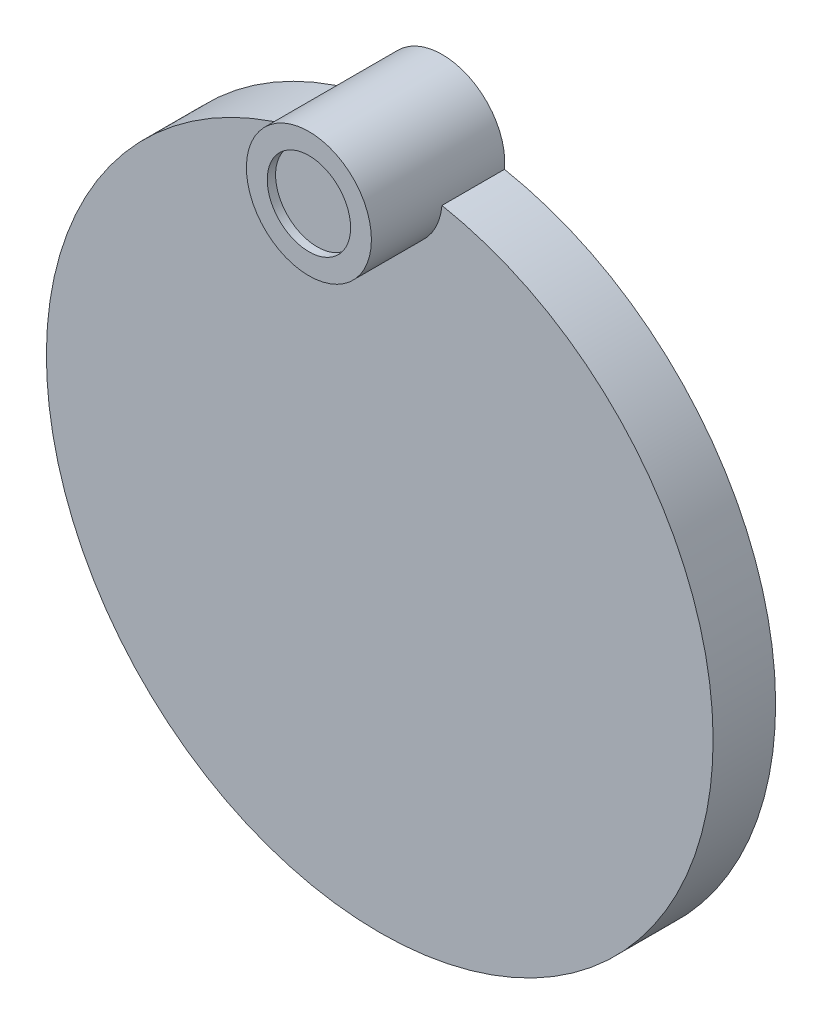
ISO-10303-21;
HEADER;
FILE_DESCRIPTION(('STEP AP214'),'2;1');
FILE_NAME('part.step','',(''),(''),'','','');
FILE_SCHEMA(('AUTOMOTIVE_DESIGN { 1 0 10303 214 1 1 1 1 }'));
ENDSEC;
DATA;
#1=APPLICATION_CONTEXT('core data for automotive mechanical design processes');
#2=APPLICATION_PROTOCOL_DEFINITION('international standard','automotive_design',2000,#1);
#3=PRODUCT_CONTEXT('',#1,'mechanical');
#4=PRODUCT('Part','Part','',(#3));
#5=PRODUCT_RELATED_PRODUCT_CATEGORY('part','',(#4));
#6=PRODUCT_DEFINITION_FORMATION('','',#4);
#7=PRODUCT_DEFINITION_CONTEXT('part definition',#1,'design');
#8=PRODUCT_DEFINITION('design','',#6,#7);
#9=PRODUCT_DEFINITION_SHAPE('','',#8);
#10=(LENGTH_UNIT() NAMED_UNIT(*) SI_UNIT(.MILLI.,.METRE.));
#11=(NAMED_UNIT(*) PLANE_ANGLE_UNIT() SI_UNIT($,.RADIAN.));
#12=(NAMED_UNIT(*) SI_UNIT($,.STERADIAN.) SOLID_ANGLE_UNIT());
#13=UNCERTAINTY_MEASURE_WITH_UNIT(LENGTH_MEASURE(1.E-05),#10,'distance_accuracy_value','');
#14=(GEOMETRIC_REPRESENTATION_CONTEXT(3) GLOBAL_UNCERTAINTY_ASSIGNED_CONTEXT((#13)) GLOBAL_UNIT_ASSIGNED_CONTEXT((#10,
#11,#12)) REPRESENTATION_CONTEXT('',''));
#15=CARTESIAN_POINT('',(0.,0.,0.));
#16=DIRECTION('',(0.,0.,1.));
#17=DIRECTION('',(1.,0.,0.));
#18=AXIS2_PLACEMENT_3D('',#15,#16,#17);
#19=CARTESIAN_POINT('',(0.,-80.,15.));
#20=DIRECTION('',(0.,0.,-1.));
#21=DIRECTION('',(-1.,0.,0.));
#22=AXIS2_PLACEMENT_3D('',#19,#20,#21);
#23=CYLINDRICAL_SURFACE('',#22,80.);
#24=CARTESIAN_POINT('',(0.,-80.,0.));
#25=DIRECTION('',(0.,0.,1.));
#26=DIRECTION('',(1.,0.,0.));
#27=AXIS2_PLACEMENT_3D('',#24,#25,#26);
#28=CIRCLE('',#27,80.);
#29=CARTESIAN_POINT('',(-14.9339365519444,-1.40625,0.));
#30=VERTEX_POINT('',#29);
#31=CARTESIAN_POINT('',(14.9339365519444,-1.40625000000001,0.));
#32=VERTEX_POINT('',#31);
#33=EDGE_CURVE('E74',#30,#32,#28,.T.);
#34=ORIENTED_EDGE('',*,*,#33,.T.);
#35=DIRECTION('',(0.,0.,-1.));
#36=VECTOR('',#35,1.);
#37=CARTESIAN_POINT('',(14.9339365519444,-1.40625000000001,15.));
#38=LINE('',#37,#36);
#39=CARTESIAN_POINT('',(14.9339365519444,-1.40625000000001,15.));
#40=VERTEX_POINT('',#39);
#41=EDGE_CURVE('E11',#40,#32,#38,.T.);
#42=ORIENTED_EDGE('',*,*,#41,.F.);
#43=CARTESIAN_POINT('',(0.,-80.,15.));
#44=DIRECTION('',(0.,0.,1.));
#45=DIRECTION('',(1.,0.,0.));
#46=AXIS2_PLACEMENT_3D('',#43,#44,#45);
#47=CIRCLE('',#46,80.);
#48=CARTESIAN_POINT('',(-14.9339365519444,-1.40625000000001,15.));
#49=VERTEX_POINT('',#48);
#50=EDGE_CURVE('E48',#49,#40,#47,.T.);
#51=ORIENTED_EDGE('',*,*,#50,.F.);
#52=DIRECTION('',(0.,0.,-1.));
#53=VECTOR('',#52,1.);
#54=CARTESIAN_POINT('',(-14.9339365519444,-1.40625,15.));
#55=LINE('',#54,#53);
#56=EDGE_CURVE('E42',#49,#30,#55,.T.);
#57=ORIENTED_EDGE('',*,*,#56,.T.);
#58=EDGE_LOOP('',(#34,#42,#51,#57));
#59=FACE_BOUND('',#58,.T.);
#60=ADVANCED_FACE('F33',(#59),#23,.T.);
#61=CARTESIAN_POINT('',(0.,0.,15.));
#62=DIRECTION('',(0.,0.,-1.));
#63=DIRECTION('',(-1.,0.,0.));
#64=AXIS2_PLACEMENT_3D('',#61,#62,#63);
#65=CYLINDRICAL_SURFACE('',#64,15.);
#66=CARTESIAN_POINT('',(0.,0.,0.));
#67=DIRECTION('',(0.,0.,1.));
#68=DIRECTION('',(1.,0.,0.));
#69=AXIS2_PLACEMENT_3D('',#66,#67,#68);
#70=CIRCLE('',#69,15.);
#71=EDGE_CURVE('E57',#32,#30,#70,.T.);
#72=ORIENTED_EDGE('',*,*,#71,.T.);
#73=ORIENTED_EDGE('',*,*,#56,.F.);
#74=CARTESIAN_POINT('',(0.,0.,15.));
#75=DIRECTION('',(0.,0.,1.));
#76=DIRECTION('',(1.,0.,0.));
#77=AXIS2_PLACEMENT_3D('',#74,#75,#76);
#78=CIRCLE('',#77,15.);
#79=EDGE_CURVE('E67',#49,#40,#78,.T.);
#80=ORIENTED_EDGE('',*,*,#79,.T.);
#81=ORIENTED_EDGE('',*,*,#41,.T.);
#82=EDGE_LOOP('',(#72,#73,#80,#81));
#83=FACE_BOUND('',#82,.T.);
#84=CARTESIAN_POINT('',(0.,0.,32.));
#85=DIRECTION('',(0.,0.,1.));
#86=DIRECTION('',(1.,0.,0.));
#87=AXIS2_PLACEMENT_3D('',#84,#85,#86);
#88=CIRCLE('',#87,15.);
#89=CARTESIAN_POINT('',(15.,0.,32.));
#90=VERTEX_POINT('',#89);
#91=EDGE_CURVE('E70',#90,#90,#88,.T.);
#92=ORIENTED_EDGE('',*,*,#91,.F.);
#93=EDGE_LOOP('',(#92));
#94=FACE_BOUND('',#93,.T.);
#95=ADVANCED_FACE('F65',(#83,#94),#65,.T.);
#96=CARTESIAN_POINT('',(0.,0.,15.));
#97=DIRECTION('',(0.,0.,1.));
#98=DIRECTION('',(1.,0.,0.));
#99=AXIS2_PLACEMENT_3D('',#96,#97,#98);
#100=PLANE('',#99);
#101=ORIENTED_EDGE('',*,*,#79,.F.);
#102=ORIENTED_EDGE('',*,*,#50,.T.);
#103=EDGE_LOOP('',(#101,#102));
#104=FACE_BOUND('',#103,.T.);
#105=ADVANCED_FACE('F69',(#104),#100,.T.);
#106=CARTESIAN_POINT('',(0.,0.,0.));
#107=DIRECTION('',(0.,0.,1.));
#108=DIRECTION('',(1.,0.,0.));
#109=AXIS2_PLACEMENT_3D('',#106,#107,#108);
#110=PLANE('',#109);
#111=ORIENTED_EDGE('',*,*,#33,.F.);
#112=ORIENTED_EDGE('',*,*,#71,.F.);
#113=EDGE_LOOP('',(#111,#112));
#114=FACE_BOUND('',#113,.T.);
#115=ADVANCED_FACE('F88',(#114),#110,.F.);
#116=CARTESIAN_POINT('',(0.,0.,32.));
#117=DIRECTION('',(0.,0.,1.));
#118=DIRECTION('',(1.,0.,0.));
#119=AXIS2_PLACEMENT_3D('',#116,#117,#118);
#120=PLANE('',#119);
#121=CARTESIAN_POINT('',(0.,0.,32.));
#122=DIRECTION('',(0.,0.,1.));
#123=DIRECTION('',(1.,0.,0.));
#124=AXIS2_PLACEMENT_3D('',#121,#122,#123);
#125=CIRCLE('',#124,10.);
#126=CARTESIAN_POINT('',(10.,0.,32.));
#127=VERTEX_POINT('',#126);
#128=EDGE_CURVE('E77',#127,#127,#125,.T.);
#129=ORIENTED_EDGE('',*,*,#128,.F.);
#130=EDGE_LOOP('',(#129));
#131=FACE_BOUND('',#130,.T.);
#132=ORIENTED_EDGE('',*,*,#91,.T.);
#133=EDGE_LOOP('',(#132));
#134=FACE_BOUND('',#133,.T.);
#135=ADVANCED_FACE('F90',(#131,#134),#120,.T.);
#136=CARTESIAN_POINT('',(0.,0.,30.));
#137=DIRECTION('',(0.,0.,1.));
#138=DIRECTION('',(1.,0.,0.));
#139=AXIS2_PLACEMENT_3D('',#136,#137,#138);
#140=CYLINDRICAL_SURFACE('',#139,10.);
#141=CARTESIAN_POINT('',(0.,0.,30.));
#142=DIRECTION('',(0.,0.,1.));
#143=DIRECTION('',(1.,0.,0.));
#144=AXIS2_PLACEMENT_3D('',#141,#142,#143);
#145=CIRCLE('',#144,10.);
#146=CARTESIAN_POINT('',(10.,0.,30.));
#147=VERTEX_POINT('',#146);
#148=EDGE_CURVE('E71',#147,#147,#145,.T.);
#149=ORIENTED_EDGE('',*,*,#148,.F.);
#150=EDGE_LOOP('',(#149));
#151=FACE_BOUND('',#150,.T.);
#152=ORIENTED_EDGE('',*,*,#128,.T.);
#153=EDGE_LOOP('',(#152));
#154=FACE_BOUND('',#153,.T.);
#155=ADVANCED_FACE('F97',(#151,#154),#140,.F.);
#156=CARTESIAN_POINT('',(0.,0.,30.));
#157=DIRECTION('',(0.,0.,1.));
#158=DIRECTION('',(1.,0.,0.));
#159=AXIS2_PLACEMENT_3D('',#156,#157,#158);
#160=PLANE('',#159);
#161=ORIENTED_EDGE('',*,*,#148,.T.);
#162=EDGE_LOOP('',(#161));
#163=FACE_BOUND('',#162,.T.);
#164=ADVANCED_FACE('F117',(#163),#160,.T.);
#165=CLOSED_SHELL('',(#60,#95,#105,#115,#135,#155,#164));
#166=MANIFOLD_SOLID_BREP('B2',#165);
#167=ADVANCED_BREP_SHAPE_REPRESENTATION('',(#18,#166),#14);
#168=SHAPE_DEFINITION_REPRESENTATION(#9,#167);
ENDSEC;
END-ISO-10303-21;
